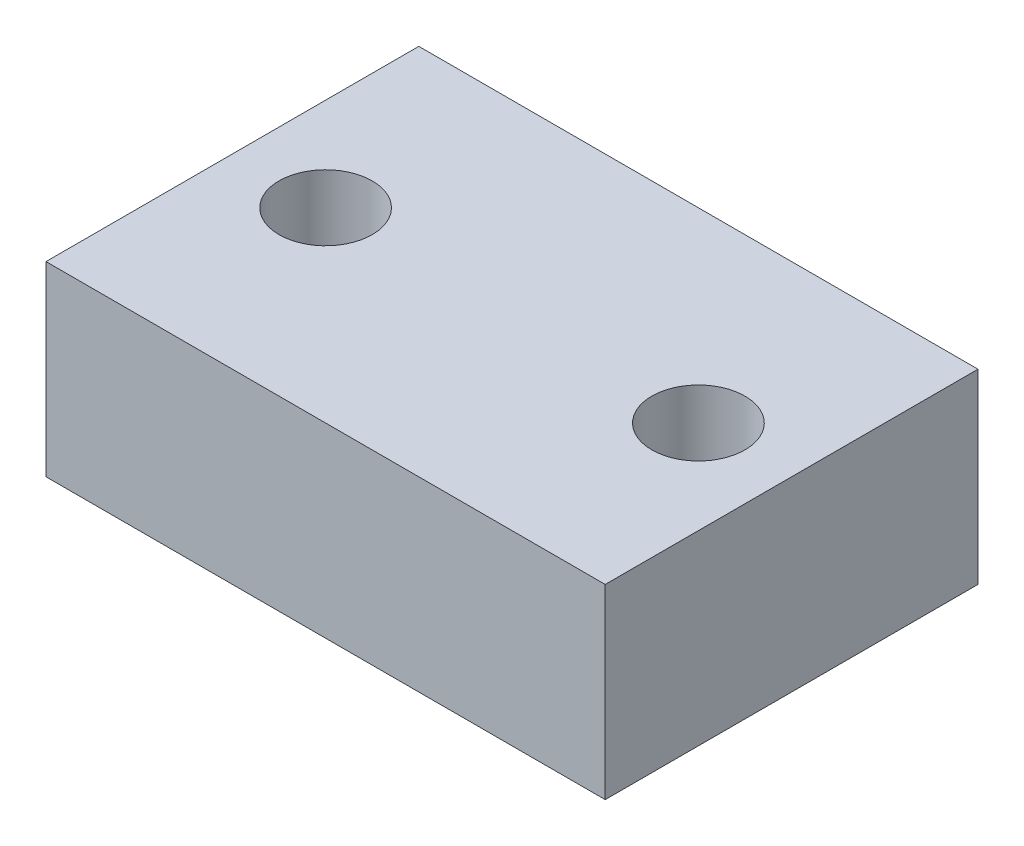
ISO-10303-21;
HEADER;
FILE_DESCRIPTION(('STEP AP214'),'2;1');
FILE_NAME('part.step','',(''),(''),'','','');
FILE_SCHEMA(('AUTOMOTIVE_DESIGN { 1 0 10303 214 1 1 1 1 }'));
ENDSEC;
DATA;
#1=APPLICATION_CONTEXT('core data for automotive mechanical design processes');
#2=APPLICATION_PROTOCOL_DEFINITION('international standard','automotive_design',2000,#1);
#3=PRODUCT_CONTEXT('',#1,'mechanical');
#4=PRODUCT('Part','Part','',(#3));
#5=PRODUCT_RELATED_PRODUCT_CATEGORY('part','',(#4));
#6=PRODUCT_DEFINITION_FORMATION('','',#4);
#7=PRODUCT_DEFINITION_CONTEXT('part definition',#1,'design');
#8=PRODUCT_DEFINITION('design','',#6,#7);
#9=PRODUCT_DEFINITION_SHAPE('','',#8);
#10=(LENGTH_UNIT() NAMED_UNIT(*) SI_UNIT(.MILLI.,.METRE.));
#11=(NAMED_UNIT(*) PLANE_ANGLE_UNIT() SI_UNIT($,.RADIAN.));
#12=(NAMED_UNIT(*) SI_UNIT($,.STERADIAN.) SOLID_ANGLE_UNIT());
#13=UNCERTAINTY_MEASURE_WITH_UNIT(LENGTH_MEASURE(1.E-05),#10,'distance_accuracy_value','');
#14=(GEOMETRIC_REPRESENTATION_CONTEXT(3) GLOBAL_UNCERTAINTY_ASSIGNED_CONTEXT((#13)) GLOBAL_UNIT_ASSIGNED_CONTEXT((#10,
#11,#12)) REPRESENTATION_CONTEXT('',''));
#15=CARTESIAN_POINT('',(0.,0.,0.));
#16=DIRECTION('',(0.,0.,1.));
#17=DIRECTION('',(1.,0.,0.));
#18=AXIS2_PLACEMENT_3D('',#15,#16,#17);
#19=CARTESIAN_POINT('',(-30.,20.,-20.));
#20=DIRECTION('',(1.,0.,0.));
#21=DIRECTION('',(0.,0.,-1.));
#22=AXIS2_PLACEMENT_3D('',#19,#20,#21);
#23=PLANE('',#22);
#24=DIRECTION('',(0.,0.,1.));
#25=VECTOR('',#24,1.);
#26=CARTESIAN_POINT('',(-30.,0.,-20.));
#27=LINE('',#26,#25);
#28=CARTESIAN_POINT('',(-30.,0.,-20.));
#29=VERTEX_POINT('',#28);
#30=CARTESIAN_POINT('',(-30.,0.,20.));
#31=VERTEX_POINT('',#30);
#32=EDGE_CURVE('E104',#29,#31,#27,.T.);
#33=ORIENTED_EDGE('',*,*,#32,.T.);
#34=DIRECTION('',(0.,-1.,0.));
#35=VECTOR('',#34,1.);
#36=CARTESIAN_POINT('',(-30.,20.,20.));
#37=LINE('',#36,#35);
#38=CARTESIAN_POINT('',(-30.,20.,20.));
#39=VERTEX_POINT('',#38);
#40=EDGE_CURVE('E11',#39,#31,#37,.T.);
#41=ORIENTED_EDGE('',*,*,#40,.F.);
#42=DIRECTION('',(0.,0.,1.));
#43=VECTOR('',#42,1.);
#44=CARTESIAN_POINT('',(-30.,20.,-20.));
#45=LINE('',#44,#43);
#46=CARTESIAN_POINT('',(-30.,20.,-20.));
#47=VERTEX_POINT('',#46);
#48=EDGE_CURVE('E92',#47,#39,#45,.T.);
#49=ORIENTED_EDGE('',*,*,#48,.F.);
#50=DIRECTION('',(0.,-1.,0.));
#51=VECTOR('',#50,1.);
#52=CARTESIAN_POINT('',(-30.,20.,-20.));
#53=LINE('',#52,#51);
#54=EDGE_CURVE('E100',#47,#29,#53,.T.);
#55=ORIENTED_EDGE('',*,*,#54,.T.);
#56=EDGE_LOOP('',(#33,#41,#49,#55));
#57=FACE_BOUND('',#56,.T.);
#58=ADVANCED_FACE('F41',(#57),#23,.F.);
#59=CARTESIAN_POINT('',(-30.,20.,20.));
#60=DIRECTION('',(0.,0.,-1.));
#61=DIRECTION('',(-1.,0.,0.));
#62=AXIS2_PLACEMENT_3D('',#59,#60,#61);
#63=PLANE('',#62);
#64=DIRECTION('',(1.,0.,0.));
#65=VECTOR('',#64,1.);
#66=CARTESIAN_POINT('',(-30.,0.,20.));
#67=LINE('',#66,#65);
#68=CARTESIAN_POINT('',(30.,0.,20.));
#69=VERTEX_POINT('',#68);
#70=EDGE_CURVE('E96',#31,#69,#67,.T.);
#71=ORIENTED_EDGE('',*,*,#70,.T.);
#72=DIRECTION('',(0.,-1.,0.));
#73=VECTOR('',#72,1.);
#74=CARTESIAN_POINT('',(30.,20.,20.));
#75=LINE('',#74,#73);
#76=CARTESIAN_POINT('',(30.,20.,20.));
#77=VERTEX_POINT('',#76);
#78=EDGE_CURVE('E49',#77,#69,#75,.T.);
#79=ORIENTED_EDGE('',*,*,#78,.F.);
#80=DIRECTION('',(1.,0.,0.));
#81=VECTOR('',#80,1.);
#82=CARTESIAN_POINT('',(-30.,20.,20.));
#83=LINE('',#82,#81);
#84=EDGE_CURVE('E87',#39,#77,#83,.T.);
#85=ORIENTED_EDGE('',*,*,#84,.F.);
#86=ORIENTED_EDGE('',*,*,#40,.T.);
#87=EDGE_LOOP('',(#71,#79,#85,#86));
#88=FACE_BOUND('',#87,.T.);
#89=ADVANCED_FACE('F95',(#88),#63,.F.);
#90=CARTESIAN_POINT('',(30.,20.,20.));
#91=DIRECTION('',(-1.,0.,0.));
#92=DIRECTION('',(0.,0.,1.));
#93=AXIS2_PLACEMENT_3D('',#90,#91,#92);
#94=PLANE('',#93);
#95=DIRECTION('',(0.,0.,-1.));
#96=VECTOR('',#95,1.);
#97=CARTESIAN_POINT('',(30.,0.,20.));
#98=LINE('',#97,#96);
#99=CARTESIAN_POINT('',(30.,0.,-20.));
#100=VERTEX_POINT('',#99);
#101=EDGE_CURVE('E74',#69,#100,#98,.T.);
#102=ORIENTED_EDGE('',*,*,#101,.T.);
#103=DIRECTION('',(0.,-1.,0.));
#104=VECTOR('',#103,1.);
#105=CARTESIAN_POINT('',(30.,20.,-20.));
#106=LINE('',#105,#104);
#107=CARTESIAN_POINT('',(30.,20.,-20.));
#108=VERTEX_POINT('',#107);
#109=EDGE_CURVE('E97',#108,#100,#106,.T.);
#110=ORIENTED_EDGE('',*,*,#109,.F.);
#111=DIRECTION('',(0.,0.,-1.));
#112=VECTOR('',#111,1.);
#113=CARTESIAN_POINT('',(30.,20.,20.));
#114=LINE('',#113,#112);
#115=EDGE_CURVE('E90',#77,#108,#114,.T.);
#116=ORIENTED_EDGE('',*,*,#115,.F.);
#117=ORIENTED_EDGE('',*,*,#78,.T.);
#118=EDGE_LOOP('',(#102,#110,#116,#117));
#119=FACE_BOUND('',#118,.T.);
#120=ADVANCED_FACE('F98',(#119),#94,.F.);
#121=CARTESIAN_POINT('',(30.,20.,-20.));
#122=DIRECTION('',(0.,0.,1.));
#123=DIRECTION('',(1.,0.,0.));
#124=AXIS2_PLACEMENT_3D('',#121,#122,#123);
#125=PLANE('',#124);
#126=DIRECTION('',(-1.,0.,0.));
#127=VECTOR('',#126,1.);
#128=CARTESIAN_POINT('',(30.,0.,-20.));
#129=LINE('',#128,#127);
#130=EDGE_CURVE('E80',#100,#29,#129,.T.);
#131=ORIENTED_EDGE('',*,*,#130,.T.);
#132=ORIENTED_EDGE('',*,*,#54,.F.);
#133=DIRECTION('',(-1.,0.,0.));
#134=VECTOR('',#133,1.);
#135=CARTESIAN_POINT('',(30.,20.,-20.));
#136=LINE('',#135,#134);
#137=EDGE_CURVE('E57',#108,#47,#136,.T.);
#138=ORIENTED_EDGE('',*,*,#137,.F.);
#139=ORIENTED_EDGE('',*,*,#109,.T.);
#140=EDGE_LOOP('',(#131,#132,#138,#139));
#141=FACE_BOUND('',#140,.T.);
#142=ADVANCED_FACE('F112',(#141),#125,.F.);
#143=CARTESIAN_POINT('',(0.,20.,0.));
#144=DIRECTION('',(0.,1.,0.));
#145=DIRECTION('',(0.,0.,1.));
#146=AXIS2_PLACEMENT_3D('',#143,#144,#145);
#147=PLANE('',#146);
#148=CARTESIAN_POINT('',(-20.,20.,0.));
#149=DIRECTION('',(0.,-1.,0.));
#150=DIRECTION('',(0.,0.,1.));
#151=AXIS2_PLACEMENT_3D('',#148,#149,#150);
#152=CIRCLE('',#151,5.);
#153=CARTESIAN_POINT('',(-20.,20.,5.));
#154=VERTEX_POINT('',#153);
#155=EDGE_CURVE('E124',#154,#154,#152,.T.);
#156=ORIENTED_EDGE('',*,*,#155,.T.);
#157=EDGE_LOOP('',(#156));
#158=FACE_BOUND('',#157,.T.);
#159=CARTESIAN_POINT('',(20.,20.,0.));
#160=DIRECTION('',(0.,1.,0.));
#161=DIRECTION('',(0.,0.,1.));
#162=AXIS2_PLACEMENT_3D('',#159,#160,#161);
#163=CIRCLE('',#162,5.);
#164=CARTESIAN_POINT('',(20.,20.,5.));
#165=VERTEX_POINT('',#164);
#166=EDGE_CURVE('E118',#165,#165,#163,.T.);
#167=ORIENTED_EDGE('',*,*,#166,.F.);
#168=EDGE_LOOP('',(#167));
#169=FACE_BOUND('',#168,.T.);
#170=ORIENTED_EDGE('',*,*,#48,.T.);
#171=ORIENTED_EDGE('',*,*,#84,.T.);
#172=ORIENTED_EDGE('',*,*,#115,.T.);
#173=ORIENTED_EDGE('',*,*,#137,.T.);
#174=EDGE_LOOP('',(#170,#171,#172,#173));
#175=FACE_BOUND('',#174,.T.);
#176=ADVANCED_FACE('F88',(#158,#169,#175),#147,.T.);
#177=CARTESIAN_POINT('',(0.,0.,0.));
#178=DIRECTION('',(0.,1.,0.));
#179=DIRECTION('',(0.,0.,1.));
#180=AXIS2_PLACEMENT_3D('',#177,#178,#179);
#181=PLANE('',#180);
#182=CARTESIAN_POINT('',(-20.,0.,0.));
#183=DIRECTION('',(0.,-1.,0.));
#184=DIRECTION('',(0.,0.,1.));
#185=AXIS2_PLACEMENT_3D('',#182,#183,#184);
#186=CIRCLE('',#185,5.);
#187=CARTESIAN_POINT('',(-20.,0.,5.));
#188=VERTEX_POINT('',#187);
#189=EDGE_CURVE('E121',#188,#188,#186,.T.);
#190=ORIENTED_EDGE('',*,*,#189,.F.);
#191=EDGE_LOOP('',(#190));
#192=FACE_BOUND('',#191,.T.);
#193=CARTESIAN_POINT('',(20.,0.,0.));
#194=DIRECTION('',(0.,1.,0.));
#195=DIRECTION('',(0.,0.,1.));
#196=AXIS2_PLACEMENT_3D('',#193,#194,#195);
#197=CIRCLE('',#196,5.);
#198=CARTESIAN_POINT('',(20.,0.,5.));
#199=VERTEX_POINT('',#198);
#200=EDGE_CURVE('E107',#199,#199,#197,.T.);
#201=ORIENTED_EDGE('',*,*,#200,.T.);
#202=EDGE_LOOP('',(#201));
#203=FACE_BOUND('',#202,.T.);
#204=ORIENTED_EDGE('',*,*,#32,.F.);
#205=ORIENTED_EDGE('',*,*,#130,.F.);
#206=ORIENTED_EDGE('',*,*,#101,.F.);
#207=ORIENTED_EDGE('',*,*,#70,.F.);
#208=EDGE_LOOP('',(#204,#205,#206,#207));
#209=FACE_BOUND('',#208,.T.);
#210=ADVANCED_FACE('F115',(#192,#203,#209),#181,.F.);
#211=CARTESIAN_POINT('',(20.,0.,0.));
#212=DIRECTION('',(0.,1.,0.));
#213=DIRECTION('',(0.,0.,1.));
#214=AXIS2_PLACEMENT_3D('',#211,#212,#213);
#215=CYLINDRICAL_SURFACE('',#214,5.);
#216=ORIENTED_EDGE('',*,*,#200,.F.);
#217=EDGE_LOOP('',(#216));
#218=FACE_BOUND('',#217,.T.);
#219=ORIENTED_EDGE('',*,*,#166,.T.);
#220=EDGE_LOOP('',(#219));
#221=FACE_BOUND('',#220,.T.);
#222=ADVANCED_FACE('F135',(#218,#221),#215,.F.);
#223=CARTESIAN_POINT('',(-20.,0.,0.));
#224=DIRECTION('',(0.,1.,0.));
#225=DIRECTION('',(0.,0.,1.));
#226=AXIS2_PLACEMENT_3D('',#223,#224,#225);
#227=CYLINDRICAL_SURFACE('',#226,5.);
#228=ORIENTED_EDGE('',*,*,#189,.T.);
#229=EDGE_LOOP('',(#228));
#230=FACE_BOUND('',#229,.T.);
#231=ORIENTED_EDGE('',*,*,#155,.F.);
#232=EDGE_LOOP('',(#231));
#233=FACE_BOUND('',#232,.T.);
#234=ADVANCED_FACE('F130',(#230,#233),#227,.F.);
#235=CLOSED_SHELL('',(#58,#89,#120,#142,#176,#210,#222,#234));
#236=MANIFOLD_SOLID_BREP('B2',#235);
#237=ADVANCED_BREP_SHAPE_REPRESENTATION('',(#18,#236),#14);
#238=SHAPE_DEFINITION_REPRESENTATION(#9,#237);
ENDSEC;
END-ISO-10303-21;
